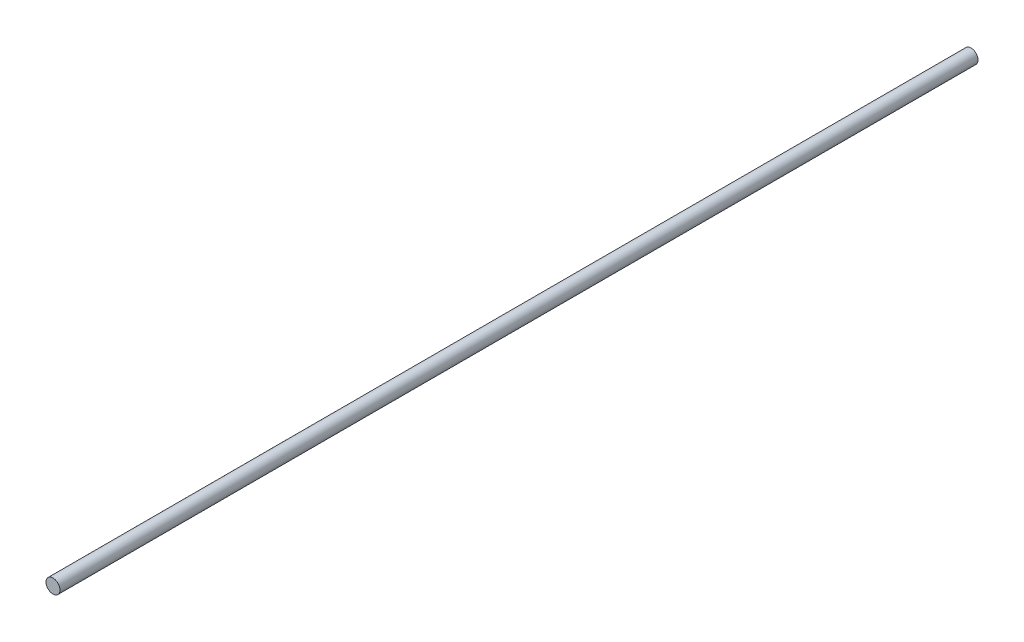
ISO-10303-21;
HEADER;
FILE_DESCRIPTION(('STEP AP214'),'2;1');
FILE_NAME('part.step','',(''),(''),'','','');
FILE_SCHEMA(('AUTOMOTIVE_DESIGN { 1 0 10303 214 1 1 1 1 }'));
ENDSEC;
DATA;
#1=APPLICATION_CONTEXT('core data for automotive mechanical design processes');
#2=APPLICATION_PROTOCOL_DEFINITION('international standard','automotive_design',2000,#1);
#3=PRODUCT_CONTEXT('',#1,'mechanical');
#4=PRODUCT('Part','Part','',(#3));
#5=PRODUCT_RELATED_PRODUCT_CATEGORY('part','',(#4));
#6=PRODUCT_DEFINITION_FORMATION('','',#4);
#7=PRODUCT_DEFINITION_CONTEXT('part definition',#1,'design');
#8=PRODUCT_DEFINITION('design','',#6,#7);
#9=PRODUCT_DEFINITION_SHAPE('','',#8);
#10=(LENGTH_UNIT() NAMED_UNIT(*) SI_UNIT(.MILLI.,.METRE.));
#11=(NAMED_UNIT(*) PLANE_ANGLE_UNIT() SI_UNIT($,.RADIAN.));
#12=(NAMED_UNIT(*) SI_UNIT($,.STERADIAN.) SOLID_ANGLE_UNIT());
#13=UNCERTAINTY_MEASURE_WITH_UNIT(LENGTH_MEASURE(1.E-05),#10,'distance_accuracy_value','');
#14=(GEOMETRIC_REPRESENTATION_CONTEXT(3) GLOBAL_UNCERTAINTY_ASSIGNED_CONTEXT((#13)) GLOBAL_UNIT_ASSIGNED_CONTEXT((#10,
#11,#12)) REPRESENTATION_CONTEXT('',''));
#15=CARTESIAN_POINT('',(0.,0.,0.));
#16=DIRECTION('',(0.,0.,1.));
#17=DIRECTION('',(1.,0.,0.));
#18=AXIS2_PLACEMENT_3D('',#15,#16,#17);
#19=CARTESIAN_POINT('',(0.,0.,658.));
#20=DIRECTION('',(0.,0.,-1.));
#21=DIRECTION('',(-1.,0.,0.));
#22=AXIS2_PLACEMENT_3D('',#19,#20,#21);
#23=CYLINDRICAL_SURFACE('',#22,5.);
#24=CARTESIAN_POINT('',(0.,0.,658.));
#25=DIRECTION('',(0.,0.,1.));
#26=DIRECTION('',(1.,0.,0.));
#27=AXIS2_PLACEMENT_3D('',#24,#25,#26);
#28=CIRCLE('',#27,5.);
#29=CARTESIAN_POINT('',(5.,0.,658.));
#30=VERTEX_POINT('',#29);
#31=EDGE_CURVE('E10',#30,#30,#28,.T.);
#32=ORIENTED_EDGE('',*,*,#31,.F.);
#33=EDGE_LOOP('',(#32));
#34=FACE_BOUND('',#33,.T.);
#35=CARTESIAN_POINT('',(0.,0.,0.));
#36=DIRECTION('',(0.,0.,1.));
#37=DIRECTION('',(1.,0.,0.));
#38=AXIS2_PLACEMENT_3D('',#35,#36,#37);
#39=CIRCLE('',#38,5.);
#40=CARTESIAN_POINT('',(5.,0.,0.));
#41=VERTEX_POINT('',#40);
#42=EDGE_CURVE('E33',#41,#41,#39,.T.);
#43=ORIENTED_EDGE('',*,*,#42,.T.);
#44=EDGE_LOOP('',(#43));
#45=FACE_BOUND('',#44,.T.);
#46=ADVANCED_FACE('F30',(#34,#45),#23,.T.);
#47=CARTESIAN_POINT('',(0.,0.,658.));
#48=DIRECTION('',(0.,0.,1.));
#49=DIRECTION('',(1.,0.,0.));
#50=AXIS2_PLACEMENT_3D('',#47,#48,#49);
#51=PLANE('',#50);
#52=ORIENTED_EDGE('',*,*,#31,.T.);
#53=EDGE_LOOP('',(#52));
#54=FACE_BOUND('',#53,.T.);
#55=ADVANCED_FACE('F45',(#54),#51,.T.);
#56=CARTESIAN_POINT('',(0.,0.,0.));
#57=DIRECTION('',(0.,0.,1.));
#58=DIRECTION('',(1.,0.,0.));
#59=AXIS2_PLACEMENT_3D('',#56,#57,#58);
#60=PLANE('',#59);
#61=ORIENTED_EDGE('',*,*,#42,.F.);
#62=EDGE_LOOP('',(#61));
#63=FACE_BOUND('',#62,.T.);
#64=ADVANCED_FACE('F43',(#63),#60,.F.);
#65=CLOSED_SHELL('',(#46,#55,#64));
#66=MANIFOLD_SOLID_BREP('B2',#65);
#67=ADVANCED_BREP_SHAPE_REPRESENTATION('',(#18,#66),#14);
#68=SHAPE_DEFINITION_REPRESENTATION(#9,#67);
ENDSEC;
END-ISO-10303-21;
